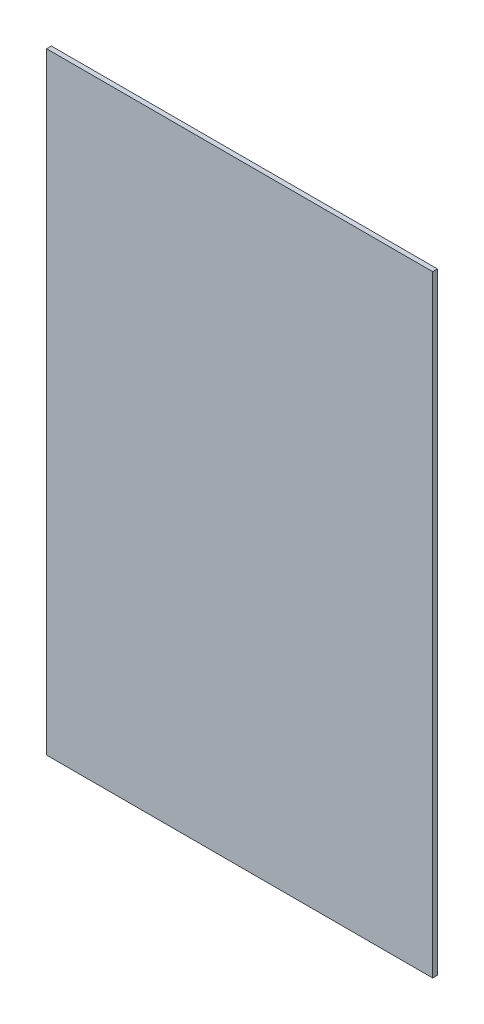
ISO-10303-21;
HEADER;
FILE_DESCRIPTION(('STEP AP214'),'2;1');
FILE_NAME('part.step','',(''),(''),'','','');
FILE_SCHEMA(('AUTOMOTIVE_DESIGN { 1 0 10303 214 1 1 1 1 }'));
ENDSEC;
DATA;
#1=APPLICATION_CONTEXT('core data for automotive mechanical design processes');
#2=APPLICATION_PROTOCOL_DEFINITION('international standard','automotive_design',2000,#1);
#3=PRODUCT_CONTEXT('',#1,'mechanical');
#4=PRODUCT('Part','Part','',(#3));
#5=PRODUCT_RELATED_PRODUCT_CATEGORY('part','',(#4));
#6=PRODUCT_DEFINITION_FORMATION('','',#4);
#7=PRODUCT_DEFINITION_CONTEXT('part definition',#1,'design');
#8=PRODUCT_DEFINITION('design','',#6,#7);
#9=PRODUCT_DEFINITION_SHAPE('','',#8);
#10=(LENGTH_UNIT() NAMED_UNIT(*) SI_UNIT(.MILLI.,.METRE.));
#11=(NAMED_UNIT(*) PLANE_ANGLE_UNIT() SI_UNIT($,.RADIAN.));
#12=(NAMED_UNIT(*) SI_UNIT($,.STERADIAN.) SOLID_ANGLE_UNIT());
#13=UNCERTAINTY_MEASURE_WITH_UNIT(LENGTH_MEASURE(1.E-05),#10,'distance_accuracy_value','');
#14=(GEOMETRIC_REPRESENTATION_CONTEXT(3) GLOBAL_UNCERTAINTY_ASSIGNED_CONTEXT((#13)) GLOBAL_UNIT_ASSIGNED_CONTEXT((#10,
#11,#12)) REPRESENTATION_CONTEXT('',''));
#15=CARTESIAN_POINT('',(0.,0.,0.));
#16=DIRECTION('',(0.,0.,1.));
#17=DIRECTION('',(1.,0.,0.));
#18=AXIS2_PLACEMENT_3D('',#15,#16,#17);
#19=CARTESIAN_POINT('',(-53.2088082243586,16.5000000000001,0.8));
#20=DIRECTION('',(1.,0.,0.));
#21=DIRECTION('',(0.,1.,0.));
#22=AXIS2_PLACEMENT_3D('',#19,#20,#21);
#23=PLANE('',#22);
#24=DIRECTION('',(0.,-1.,0.));
#25=VECTOR('',#24,1.);
#26=CARTESIAN_POINT('',(-53.2088082243586,16.5000000000001,0.));
#27=LINE('',#26,#25);
#28=CARTESIAN_POINT('',(-53.2088082243586,16.5000000000001,0.));
#29=VERTEX_POINT('',#28);
#30=CARTESIAN_POINT('',(-53.2088082243586,-86.4999999999999,0.));
#31=VERTEX_POINT('',#30);
#32=EDGE_CURVE('E96',#29,#31,#27,.T.);
#33=ORIENTED_EDGE('',*,*,#32,.T.);
#34=DIRECTION('',(0.,0.,-1.));
#35=VECTOR('',#34,1.);
#36=CARTESIAN_POINT('',(-53.2088082243586,-86.4999999999999,0.8));
#37=LINE('',#36,#35);
#38=CARTESIAN_POINT('',(-53.2088082243586,-86.4999999999999,0.8));
#39=VERTEX_POINT('',#38);
#40=EDGE_CURVE('E11',#39,#31,#37,.T.);
#41=ORIENTED_EDGE('',*,*,#40,.F.);
#42=DIRECTION('',(0.,-1.,0.));
#43=VECTOR('',#42,1.);
#44=CARTESIAN_POINT('',(-53.2088082243586,16.5000000000001,0.8));
#45=LINE('',#44,#43);
#46=CARTESIAN_POINT('',(-53.2088082243586,16.5000000000001,0.8));
#47=VERTEX_POINT('',#46);
#48=EDGE_CURVE('E84',#47,#39,#45,.T.);
#49=ORIENTED_EDGE('',*,*,#48,.F.);
#50=DIRECTION('',(0.,0.,-1.));
#51=VECTOR('',#50,1.);
#52=CARTESIAN_POINT('',(-53.2088082243586,16.5000000000001,0.8));
#53=LINE('',#52,#51);
#54=EDGE_CURVE('E92',#47,#29,#53,.T.);
#55=ORIENTED_EDGE('',*,*,#54,.T.);
#56=EDGE_LOOP('',(#33,#41,#49,#55));
#57=FACE_BOUND('',#56,.T.);
#58=ADVANCED_FACE('F33',(#57),#23,.F.);
#59=CARTESIAN_POINT('',(-53.2088082243586,-86.4999999999999,0.8));
#60=DIRECTION('',(0.,1.,0.));
#61=DIRECTION('',(0.,0.,1.));
#62=AXIS2_PLACEMENT_3D('',#59,#60,#61);
#63=PLANE('',#62);
#64=DIRECTION('',(1.,0.,0.));
#65=VECTOR('',#64,1.);
#66=CARTESIAN_POINT('',(-53.2088082243586,-86.4999999999999,0.));
#67=LINE('',#66,#65);
#68=CARTESIAN_POINT('',(11.7911917756414,-86.4999999999999,0.));
#69=VERTEX_POINT('',#68);
#70=EDGE_CURVE('E88',#31,#69,#67,.T.);
#71=ORIENTED_EDGE('',*,*,#70,.T.);
#72=DIRECTION('',(0.,0.,-1.));
#73=VECTOR('',#72,1.);
#74=CARTESIAN_POINT('',(11.7911917756414,-86.4999999999999,0.8));
#75=LINE('',#74,#73);
#76=CARTESIAN_POINT('',(11.7911917756414,-86.4999999999999,0.8));
#77=VERTEX_POINT('',#76);
#78=EDGE_CURVE('E41',#77,#69,#75,.T.);
#79=ORIENTED_EDGE('',*,*,#78,.F.);
#80=DIRECTION('',(1.,0.,0.));
#81=VECTOR('',#80,1.);
#82=CARTESIAN_POINT('',(-53.2088082243586,-86.4999999999999,0.8));
#83=LINE('',#82,#81);
#84=EDGE_CURVE('E79',#39,#77,#83,.T.);
#85=ORIENTED_EDGE('',*,*,#84,.F.);
#86=ORIENTED_EDGE('',*,*,#40,.T.);
#87=EDGE_LOOP('',(#71,#79,#85,#86));
#88=FACE_BOUND('',#87,.T.);
#89=ADVANCED_FACE('F87',(#88),#63,.F.);
#90=CARTESIAN_POINT('',(11.7911917756414,16.5000000000001,0.8));
#91=DIRECTION('',(-1.,0.,0.));
#92=DIRECTION('',(0.,-1.,0.));
#93=AXIS2_PLACEMENT_3D('',#90,#91,#92);
#94=PLANE('',#93);
#95=DIRECTION('',(0.,1.,0.));
#96=VECTOR('',#95,1.);
#97=CARTESIAN_POINT('',(11.7911917756414,16.5000000000001,0.));
#98=LINE('',#97,#96);
#99=CARTESIAN_POINT('',(11.7911917756414,16.5000000000001,0.));
#100=VERTEX_POINT('',#99);
#101=EDGE_CURVE('E66',#69,#100,#98,.T.);
#102=ORIENTED_EDGE('',*,*,#101,.T.);
#103=DIRECTION('',(0.,0.,-1.));
#104=VECTOR('',#103,1.);
#105=CARTESIAN_POINT('',(11.7911917756414,16.5000000000001,0.8));
#106=LINE('',#105,#104);
#107=CARTESIAN_POINT('',(11.7911917756414,16.5000000000001,0.8));
#108=VERTEX_POINT('',#107);
#109=EDGE_CURVE('E89',#108,#100,#106,.T.);
#110=ORIENTED_EDGE('',*,*,#109,.F.);
#111=DIRECTION('',(0.,1.,0.));
#112=VECTOR('',#111,1.);
#113=CARTESIAN_POINT('',(11.7911917756414,16.5000000000001,0.8));
#114=LINE('',#113,#112);
#115=EDGE_CURVE('E82',#77,#108,#114,.T.);
#116=ORIENTED_EDGE('',*,*,#115,.F.);
#117=ORIENTED_EDGE('',*,*,#78,.T.);
#118=EDGE_LOOP('',(#102,#110,#116,#117));
#119=FACE_BOUND('',#118,.T.);
#120=ADVANCED_FACE('F90',(#119),#94,.F.);
#121=CARTESIAN_POINT('',(-53.2088082243586,16.5000000000001,0.8));
#122=DIRECTION('',(0.,-1.,0.));
#123=DIRECTION('',(0.,0.,-1.));
#124=AXIS2_PLACEMENT_3D('',#121,#122,#123);
#125=PLANE('',#124);
#126=DIRECTION('',(-1.,0.,0.));
#127=VECTOR('',#126,1.);
#128=CARTESIAN_POINT('',(-53.2088082243586,16.5000000000001,0.));
#129=LINE('',#128,#127);
#130=EDGE_CURVE('E72',#100,#29,#129,.T.);
#131=ORIENTED_EDGE('',*,*,#130,.T.);
#132=ORIENTED_EDGE('',*,*,#54,.F.);
#133=DIRECTION('',(-1.,0.,0.));
#134=VECTOR('',#133,1.);
#135=CARTESIAN_POINT('',(-53.2088082243586,16.5000000000001,0.8));
#136=LINE('',#135,#134);
#137=EDGE_CURVE('E49',#108,#47,#136,.T.);
#138=ORIENTED_EDGE('',*,*,#137,.F.);
#139=ORIENTED_EDGE('',*,*,#109,.T.);
#140=EDGE_LOOP('',(#131,#132,#138,#139));
#141=FACE_BOUND('',#140,.T.);
#142=ADVANCED_FACE('F103',(#141),#125,.F.);
#143=CARTESIAN_POINT('',(0.,0.,0.8));
#144=DIRECTION('',(0.,0.,1.));
#145=DIRECTION('',(1.,0.,0.));
#146=AXIS2_PLACEMENT_3D('',#143,#144,#145);
#147=PLANE('',#146);
#148=ORIENTED_EDGE('',*,*,#48,.T.);
#149=ORIENTED_EDGE('',*,*,#84,.T.);
#150=ORIENTED_EDGE('',*,*,#115,.T.);
#151=ORIENTED_EDGE('',*,*,#137,.T.);
#152=EDGE_LOOP('',(#148,#149,#150,#151));
#153=FACE_BOUND('',#152,.T.);
#154=ADVANCED_FACE('F80',(#153),#147,.T.);
#155=CARTESIAN_POINT('',(0.,0.,0.));
#156=DIRECTION('',(0.,0.,1.));
#157=DIRECTION('',(1.,0.,0.));
#158=AXIS2_PLACEMENT_3D('',#155,#156,#157);
#159=PLANE('',#158);
#160=ORIENTED_EDGE('',*,*,#32,.F.);
#161=ORIENTED_EDGE('',*,*,#130,.F.);
#162=ORIENTED_EDGE('',*,*,#101,.F.);
#163=ORIENTED_EDGE('',*,*,#70,.F.);
#164=EDGE_LOOP('',(#160,#161,#162,#163));
#165=FACE_BOUND('',#164,.T.);
#166=ADVANCED_FACE('F106',(#165),#159,.F.);
#167=CLOSED_SHELL('',(#58,#89,#120,#142,#154,#166));
#168=MANIFOLD_SOLID_BREP('B2',#167);
#169=ADVANCED_BREP_SHAPE_REPRESENTATION('',(#18,#168),#14);
#170=SHAPE_DEFINITION_REPRESENTATION(#9,#169);
ENDSEC;
END-ISO-10303-21;
